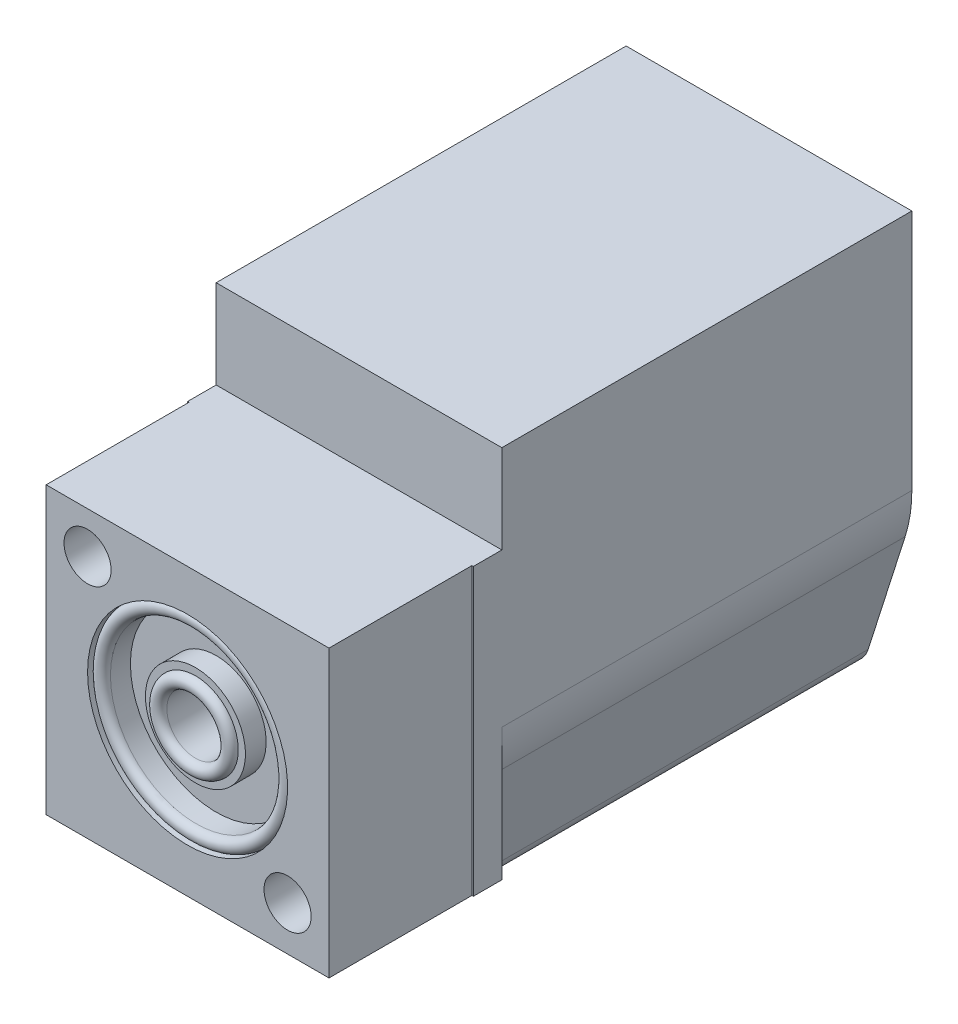
ISO-10303-21;
HEADER;
FILE_DESCRIPTION(('STEP AP214'),'2;1');
FILE_NAME('part.step','',(''),(''),'','','');
FILE_SCHEMA(('AUTOMOTIVE_DESIGN { 1 0 10303 214 1 1 1 1 }'));
ENDSEC;
DATA;
#1=APPLICATION_CONTEXT('core data for automotive mechanical design processes');
#2=APPLICATION_PROTOCOL_DEFINITION('international standard','automotive_design',2000,#1);
#3=PRODUCT_CONTEXT('',#1,'mechanical');
#4=PRODUCT('Part','Part','',(#3));
#5=PRODUCT_RELATED_PRODUCT_CATEGORY('part','',(#4));
#6=PRODUCT_DEFINITION_FORMATION('','',#4);
#7=PRODUCT_DEFINITION_CONTEXT('part definition',#1,'design');
#8=PRODUCT_DEFINITION('design','',#6,#7);
#9=PRODUCT_DEFINITION_SHAPE('','',#8);
#10=(LENGTH_UNIT() NAMED_UNIT(*) SI_UNIT(.MILLI.,.METRE.));
#11=(NAMED_UNIT(*) PLANE_ANGLE_UNIT() SI_UNIT($,.RADIAN.));
#12=(NAMED_UNIT(*) SI_UNIT($,.STERADIAN.) SOLID_ANGLE_UNIT());
#13=UNCERTAINTY_MEASURE_WITH_UNIT(LENGTH_MEASURE(1.E-05),#10,'distance_accuracy_value','');
#14=(GEOMETRIC_REPRESENTATION_CONTEXT(3) GLOBAL_UNCERTAINTY_ASSIGNED_CONTEXT((#13)) GLOBAL_UNIT_ASSIGNED_CONTEXT((#10,
#11,#12)) REPRESENTATION_CONTEXT('',''));
#15=CARTESIAN_POINT('',(0.,0.,0.));
#16=DIRECTION('',(0.,0.,1.));
#17=DIRECTION('',(1.,0.,0.));
#18=AXIS2_PLACEMENT_3D('',#15,#16,#17);
#19=CARTESIAN_POINT('',(2.999642866253,-9.099642866253,28.7));
#20=DIRECTION('',(0.,0.,-1.));
#21=DIRECTION('',(0.,-1.,0.));
#22=AXIS2_PLACEMENT_3D('',#19,#20,#21);
#23=PLANE('',#22);
#24=CARTESIAN_POINT('',(2.999642866253,-9.099642866253,28.7));
#25=DIRECTION('',(0.,0.,-1.));
#26=DIRECTION('',(-1.,0.,0.));
#27=AXIS2_PLACEMENT_3D('',#24,#25,#26);
#28=CIRCLE('',#27,1.65);
#29=CARTESIAN_POINT('',(4.649642866253,-9.099642866253,28.7));
#30=VERTEX_POINT('',#29);
#31=EDGE_CURVE('E11',#30,#30,#28,.T.);
#32=ORIENTED_EDGE('',*,*,#31,.F.);
#33=EDGE_LOOP('',(#32));
#34=FACE_BOUND('',#33,.T.);
#35=ADVANCED_FACE('F17',(#34),#23,.F.);
#36=CARTESIAN_POINT('',(2.999642866253,-9.099642866253,40.7));
#37=DIRECTION('',(0.,0.,-1.));
#38=DIRECTION('',(-1.,0.,0.));
#39=AXIS2_PLACEMENT_3D('',#36,#37,#38);
#40=CYLINDRICAL_SURFACE('',#39,1.65);
#41=CARTESIAN_POINT('',(2.999642866253,-9.099642866253,40.7));
#42=DIRECTION('',(0.,0.,-1.));
#43=DIRECTION('',(-1.,0.,0.));
#44=AXIS2_PLACEMENT_3D('',#41,#42,#43);
#45=CIRCLE('',#44,1.65);
#46=CARTESIAN_POINT('',(4.649642866253,-9.099642866253,40.7));
#47=VERTEX_POINT('',#46);
#48=EDGE_CURVE('E272',#47,#47,#45,.T.);
#49=ORIENTED_EDGE('',*,*,#48,.F.);
#50=DIRECTION('',(0.,0.,-1.));
#51=VECTOR('',#50,1.);
#52=CARTESIAN_POINT('',(4.649642866253,-9.099642866253,40.7));
#53=LINE('',#52,#51);
#54=EDGE_CURVE('E28',#47,#30,#53,.T.);
#55=ORIENTED_EDGE('',*,*,#54,.T.);
#56=ORIENTED_EDGE('',*,*,#31,.T.);
#57=ORIENTED_EDGE('',*,*,#54,.F.);
#58=EDGE_LOOP('',(#49,#55,#56,#57));
#59=FACE_BOUND('',#58,.T.);
#60=ADVANCED_FACE('F676',(#59),#40,.F.);
#61=CARTESIAN_POINT('',(10.,-16.1,35.7));
#62=DIRECTION('',(0.,0.,-1.));
#63=DIRECTION('',(0.,-1.,0.));
#64=AXIS2_PLACEMENT_3D('',#61,#62,#63);
#65=PLANE('',#64);
#66=CARTESIAN_POINT('',(10.,-16.1,35.7));
#67=DIRECTION('',(0.,0.,-1.));
#68=DIRECTION('',(-1.,0.,0.));
#69=AXIS2_PLACEMENT_3D('',#66,#67,#68);
#70=CIRCLE('',#69,1.25);
#71=CARTESIAN_POINT('',(11.25,-16.1,35.7));
#72=VERTEX_POINT('',#71);
#73=EDGE_CURVE('E21',#72,#72,#70,.T.);
#74=ORIENTED_EDGE('',*,*,#73,.F.);
#75=EDGE_LOOP('',(#74));
#76=FACE_BOUND('',#75,.T.);
#77=ADVANCED_FACE('F681',(#76),#65,.F.);
#78=CARTESIAN_POINT('',(10.,-16.1,40.7));
#79=DIRECTION('',(0.,0.,-1.));
#80=DIRECTION('',(-1.,0.,0.));
#81=AXIS2_PLACEMENT_3D('',#78,#79,#80);
#82=CYLINDRICAL_SURFACE('',#81,1.25);
#83=CARTESIAN_POINT('',(10.,-16.1,37.3));
#84=DIRECTION('',(0.,0.,-1.));
#85=DIRECTION('',(-1.,0.,0.));
#86=AXIS2_PLACEMENT_3D('',#83,#84,#85);
#87=CIRCLE('',#86,1.25);
#88=CARTESIAN_POINT('',(11.25,-16.1,37.3));
#89=VERTEX_POINT('',#88);
#90=EDGE_CURVE('E358',#89,#89,#87,.T.);
#91=ORIENTED_EDGE('',*,*,#90,.F.);
#92=DIRECTION('',(0.,0.,-1.));
#93=VECTOR('',#92,1.);
#94=CARTESIAN_POINT('',(11.25,-16.1,40.7));
#95=LINE('',#94,#93);
#96=EDGE_CURVE('E362',#89,#72,#95,.T.);
#97=ORIENTED_EDGE('',*,*,#96,.T.);
#98=ORIENTED_EDGE('',*,*,#73,.T.);
#99=ORIENTED_EDGE('',*,*,#96,.F.);
#100=EDGE_LOOP('',(#91,#97,#98,#99));
#101=FACE_BOUND('',#100,.T.);
#102=ADVANCED_FACE('F795',(#101),#82,.F.);
#103=CARTESIAN_POINT('',(10.,-16.1,37.3));
#104=DIRECTION('',(0.,0.,-1.));
#105=DIRECTION('',(0.,-1.,0.));
#106=AXIS2_PLACEMENT_3D('',#103,#104,#105);
#107=PLANE('',#106);
#108=ORIENTED_EDGE('',*,*,#90,.T.);
#109=EDGE_LOOP('',(#108));
#110=FACE_BOUND('',#109,.T.);
#111=CARTESIAN_POINT('',(10.,-16.1,37.3));
#112=DIRECTION('',(0.,0.,-1.));
#113=DIRECTION('',(1.,0.,0.));
#114=AXIS2_PLACEMENT_3D('',#111,#112,#113);
#115=CIRCLE('',#114,2.);
#116=CARTESIAN_POINT('',(8.,-16.1,37.3));
#117=VERTEX_POINT('',#116);
#118=EDGE_CURVE('E363',#117,#117,#115,.T.);
#119=ORIENTED_EDGE('',*,*,#118,.F.);
#120=EDGE_LOOP('',(#119));
#121=FACE_BOUND('',#120,.T.);
#122=ADVANCED_FACE('F867',(#110,#121),#107,.F.);
#123=CARTESIAN_POINT('',(10.,-16.1,40.87));
#124=DIRECTION('',(0.,0.,-1.));
#125=DIRECTION('',(1.,0.,0.));
#126=AXIS2_PLACEMENT_3D('',#123,#124,#125);
#127=CYLINDRICAL_SURFACE('',#126,2.);
#128=CARTESIAN_POINT('',(10.,-16.1,40.15));
#129=DIRECTION('',(0.,0.,-1.));
#130=DIRECTION('',(1.,0.,0.));
#131=AXIS2_PLACEMENT_3D('',#128,#129,#130);
#132=CIRCLE('',#131,2.);
#133=CARTESIAN_POINT('',(8.,-16.1,40.15));
#134=VERTEX_POINT('',#133);
#135=EDGE_CURVE('E346',#134,#134,#132,.T.);
#136=ORIENTED_EDGE('',*,*,#135,.F.);
#137=DIRECTION('',(0.,0.,-1.));
#138=VECTOR('',#137,1.);
#139=CARTESIAN_POINT('',(8.,-16.1,40.87));
#140=LINE('',#139,#138);
#141=EDGE_CURVE('E350',#134,#117,#140,.T.);
#142=ORIENTED_EDGE('',*,*,#141,.T.);
#143=ORIENTED_EDGE('',*,*,#118,.T.);
#144=ORIENTED_EDGE('',*,*,#141,.F.);
#145=EDGE_LOOP('',(#136,#142,#143,#144));
#146=FACE_BOUND('',#145,.T.);
#147=ADVANCED_FACE('F772',(#146),#127,.F.);
#148=CARTESIAN_POINT('',(10.,-16.1,40.15));
#149=DIRECTION('',(0.,0.,-1.));
#150=DIRECTION('',(1.,0.,0.));
#151=AXIS2_PLACEMENT_3D('',#148,#149,#150);
#152=TOROIDAL_SURFACE('',#151,2.5,0.5);
#153=CARTESIAN_POINT('',(10.,-16.1,40.15));
#154=DIRECTION('',(0.,0.,1.));
#155=DIRECTION('',(1.,0.,0.));
#156=AXIS2_PLACEMENT_3D('',#153,#154,#155);
#157=CIRCLE('',#156,3.);
#158=CARTESIAN_POINT('',(7.,-16.1,40.15));
#159=VERTEX_POINT('',#158);
#160=EDGE_CURVE('E324',#159,#159,#157,.T.);
#161=ORIENTED_EDGE('',*,*,#160,.T.);
#162=CARTESIAN_POINT('',(7.5,-16.1,40.15));
#163=DIRECTION('',(0.,1.,0.));
#164=DIRECTION('',(-1.,0.,0.));
#165=AXIS2_PLACEMENT_3D('',#162,#163,#164);
#166=CIRCLE('',#165,0.5);
#167=EDGE_CURVE('E351',#159,#134,#166,.T.);
#168=ORIENTED_EDGE('',*,*,#167,.T.);
#169=ORIENTED_EDGE('',*,*,#135,.T.);
#170=ORIENTED_EDGE('',*,*,#167,.F.);
#171=EDGE_LOOP('',(#161,#168,#169,#170));
#172=FACE_BOUND('',#171,.T.);
#173=ADVANCED_FACE('F752',(#172),#152,.T.);
#174=CARTESIAN_POINT('',(10.,-16.1,40.15));
#175=DIRECTION('',(0.,0.,-1.));
#176=DIRECTION('',(0.,-1.,0.));
#177=AXIS2_PLACEMENT_3D('',#174,#175,#176);
#178=PLANE('',#177);
#179=ORIENTED_EDGE('',*,*,#160,.F.);
#180=EDGE_LOOP('',(#179));
#181=FACE_BOUND('',#180,.T.);
#182=CARTESIAN_POINT('',(10.,-16.1,40.15));
#183=DIRECTION('',(0.,0.,-1.));
#184=DIRECTION('',(-1.,0.,0.));
#185=AXIS2_PLACEMENT_3D('',#182,#183,#184);
#186=CIRCLE('',#185,3.5);
#187=CARTESIAN_POINT('',(6.5,-16.1,40.15));
#188=VERTEX_POINT('',#187);
#189=EDGE_CURVE('E321',#188,#188,#186,.T.);
#190=ORIENTED_EDGE('',*,*,#189,.F.);
#191=EDGE_LOOP('',(#190));
#192=FACE_BOUND('',#191,.T.);
#193=ADVANCED_FACE('F747',(#181,#192),#178,.F.);
#194=CARTESIAN_POINT('',(10.,-16.1,40.8));
#195=DIRECTION('',(0.,0.,-1.));
#196=DIRECTION('',(1.,0.,0.));
#197=AXIS2_PLACEMENT_3D('',#194,#195,#196);
#198=CYLINDRICAL_SURFACE('',#197,3.5);
#199=CARTESIAN_POINT('',(10.,-16.1,38.7));
#200=DIRECTION('',(0.,0.,1.));
#201=DIRECTION('',(1.,0.,0.));
#202=AXIS2_PLACEMENT_3D('',#199,#200,#201);
#203=CIRCLE('',#202,3.5);
#204=CARTESIAN_POINT('',(6.5,-16.1,38.7));
#205=VERTEX_POINT('',#204);
#206=EDGE_CURVE('E429',#205,#205,#203,.T.);
#207=ORIENTED_EDGE('',*,*,#206,.T.);
#208=DIRECTION('',(0.,0.,1.));
#209=VECTOR('',#208,1.);
#210=CARTESIAN_POINT('',(6.5,-16.1,40.8));
#211=LINE('',#210,#209);
#212=EDGE_CURVE('E325',#205,#188,#211,.T.);
#213=ORIENTED_EDGE('',*,*,#212,.T.);
#214=ORIENTED_EDGE('',*,*,#189,.T.);
#215=ORIENTED_EDGE('',*,*,#212,.F.);
#216=EDGE_LOOP('',(#207,#213,#214,#215));
#217=FACE_BOUND('',#216,.T.);
#218=ADVANCED_FACE('F19',(#217),#198,.T.);
#219=CARTESIAN_POINT('',(10.,-16.1,38.7));
#220=DIRECTION('',(0.,0.,-1.));
#221=DIRECTION('',(0.,-1.,0.));
#222=AXIS2_PLACEMENT_3D('',#219,#220,#221);
#223=PLANE('',#222);
#224=ORIENTED_EDGE('',*,*,#206,.F.);
#225=EDGE_LOOP('',(#224));
#226=FACE_BOUND('',#225,.T.);
#227=CARTESIAN_POINT('',(10.,-16.1,38.7));
#228=DIRECTION('',(0.,0.,1.));
#229=DIRECTION('',(1.,0.,0.));
#230=AXIS2_PLACEMENT_3D('',#227,#228,#229);
#231=CIRCLE('',#230,6.);
#232=CARTESIAN_POINT('',(4.,-16.1,38.7));
#233=VERTEX_POINT('',#232);
#234=EDGE_CURVE('E522',#233,#233,#231,.T.);
#235=ORIENTED_EDGE('',*,*,#234,.T.);
#236=EDGE_LOOP('',(#235));
#237=FACE_BOUND('',#236,.T.);
#238=ADVANCED_FACE('F847',(#226,#237),#223,.F.);
#239=CARTESIAN_POINT('',(10.,-16.1,40.8));
#240=DIRECTION('',(0.,0.,-1.));
#241=DIRECTION('',(1.,0.,0.));
#242=AXIS2_PLACEMENT_3D('',#239,#240,#241);
#243=CYLINDRICAL_SURFACE('',#242,6.);
#244=CARTESIAN_POINT('',(10.,-16.1,40.1));
#245=DIRECTION('',(0.,0.,-1.));
#246=DIRECTION('',(-1.,0.,0.));
#247=AXIS2_PLACEMENT_3D('',#244,#245,#246);
#248=CIRCLE('',#247,6.);
#249=CARTESIAN_POINT('',(4.,-16.1,40.1));
#250=VERTEX_POINT('',#249);
#251=EDGE_CURVE('E416',#250,#250,#248,.T.);
#252=ORIENTED_EDGE('',*,*,#251,.F.);
#253=DIRECTION('',(0.,0.,-1.));
#254=VECTOR('',#253,1.);
#255=CARTESIAN_POINT('',(4.,-16.1,40.8));
#256=LINE('',#255,#254);
#257=EDGE_CURVE('E512',#250,#233,#256,.T.);
#258=ORIENTED_EDGE('',*,*,#257,.T.);
#259=ORIENTED_EDGE('',*,*,#234,.F.);
#260=ORIENTED_EDGE('',*,*,#257,.F.);
#261=EDGE_LOOP('',(#252,#258,#259,#260));
#262=FACE_BOUND('',#261,.T.);
#263=ADVANCED_FACE('F841',(#262),#243,.F.);
#264=CARTESIAN_POINT('',(10.,-16.1,40.1));
#265=DIRECTION('',(0.,0.,-1.));
#266=DIRECTION('',(1.,0.,0.));
#267=AXIS2_PLACEMENT_3D('',#264,#265,#266);
#268=TOROIDAL_SURFACE('',#267,6.5,0.5);
#269=CARTESIAN_POINT('',(10.,-16.1,40.1));
#270=DIRECTION('',(0.,0.,-1.));
#271=DIRECTION('',(1.,0.,0.));
#272=AXIS2_PLACEMENT_3D('',#269,#270,#271);
#273=CIRCLE('',#272,7.);
#274=CARTESIAN_POINT('',(3.,-16.1,40.1));
#275=VERTEX_POINT('',#274);
#276=EDGE_CURVE('E382',#275,#275,#273,.T.);
#277=ORIENTED_EDGE('',*,*,#276,.F.);
#278=CARTESIAN_POINT('',(3.5,-16.1,40.1));
#279=DIRECTION('',(0.,1.,0.));
#280=DIRECTION('',(-1.,0.,0.));
#281=AXIS2_PLACEMENT_3D('',#278,#279,#280);
#282=CIRCLE('',#281,0.5);
#283=EDGE_CURVE('E386',#275,#250,#282,.T.);
#284=ORIENTED_EDGE('',*,*,#283,.T.);
#285=ORIENTED_EDGE('',*,*,#251,.T.);
#286=ORIENTED_EDGE('',*,*,#283,.F.);
#287=EDGE_LOOP('',(#277,#284,#285,#286));
#288=FACE_BOUND('',#287,.T.);
#289=ADVANCED_FACE('F715',(#288),#268,.T.);
#290=CARTESIAN_POINT('',(10.,-16.1,40.73));
#291=DIRECTION('',(0.,0.,-1.));
#292=DIRECTION('',(1.,0.,0.));
#293=AXIS2_PLACEMENT_3D('',#290,#291,#292);
#294=CYLINDRICAL_SURFACE('',#293,7.);
#295=CARTESIAN_POINT('',(10.,-16.1,40.7));
#296=DIRECTION('',(0.,0.,-1.));
#297=DIRECTION('',(1.,0.,0.));
#298=AXIS2_PLACEMENT_3D('',#295,#296,#297);
#299=CIRCLE('',#298,7.);
#300=CARTESIAN_POINT('',(3.,-16.1,40.7));
#301=VERTEX_POINT('',#300);
#302=EDGE_CURVE('E279',#301,#301,#299,.T.);
#303=ORIENTED_EDGE('',*,*,#302,.F.);
#304=DIRECTION('',(0.,0.,-1.));
#305=VECTOR('',#304,1.);
#306=CARTESIAN_POINT('',(3.,-16.1,40.73));
#307=LINE('',#306,#305);
#308=EDGE_CURVE('E387',#301,#275,#307,.T.);
#309=ORIENTED_EDGE('',*,*,#308,.T.);
#310=ORIENTED_EDGE('',*,*,#276,.T.);
#311=ORIENTED_EDGE('',*,*,#308,.F.);
#312=EDGE_LOOP('',(#303,#309,#310,#311));
#313=FACE_BOUND('',#312,.T.);
#314=ADVANCED_FACE('F709',(#313),#294,.F.);
#315=CARTESIAN_POINT('',(19.9,-26.2,30.7));
#316=DIRECTION('',(1.,0.,0.));
#317=DIRECTION('',(0.,1.,0.));
#318=AXIS2_PLACEMENT_3D('',#315,#316,#317);
#319=PLANE('',#318);
#320=DIRECTION('',(0.,1.,0.));
#321=VECTOR('',#320,1.);
#322=CARTESIAN_POINT('',(19.9,-26.2,30.7));
#323=LINE('',#322,#321);
#324=CARTESIAN_POINT('',(19.9,-26.2,30.7));
#325=VERTEX_POINT('',#324);
#326=CARTESIAN_POINT('',(19.9,-6.2,30.7));
#327=VERTEX_POINT('',#326);
#328=EDGE_CURVE('E453',#325,#327,#323,.T.);
#329=ORIENTED_EDGE('',*,*,#328,.T.);
#330=DIRECTION('',(0.,0.,1.));
#331=VECTOR('',#330,1.);
#332=CARTESIAN_POINT('',(19.9,-6.2,30.7));
#333=LINE('',#332,#331);
#334=CARTESIAN_POINT('',(19.9,-6.2,40.7));
#335=VERTEX_POINT('',#334);
#336=EDGE_CURVE('E409',#327,#335,#333,.T.);
#337=ORIENTED_EDGE('',*,*,#336,.T.);
#338=DIRECTION('',(0.,1.,0.));
#339=VECTOR('',#338,1.);
#340=CARTESIAN_POINT('',(19.9,-26.2,40.7));
#341=LINE('',#340,#339);
#342=CARTESIAN_POINT('',(19.9,-26.2,40.7));
#343=VERTEX_POINT('',#342);
#344=EDGE_CURVE('E393',#343,#335,#341,.T.);
#345=ORIENTED_EDGE('',*,*,#344,.F.);
#346=DIRECTION('',(0.,0.,1.));
#347=VECTOR('',#346,1.);
#348=CARTESIAN_POINT('',(19.9,-26.2,30.7));
#349=LINE('',#348,#347);
#350=EDGE_CURVE('E333',#325,#343,#349,.T.);
#351=ORIENTED_EDGE('',*,*,#350,.F.);
#352=EDGE_LOOP('',(#329,#337,#345,#351));
#353=FACE_BOUND('',#352,.T.);
#354=ADVANCED_FACE('F714',(#353),#319,.T.);
#355=CARTESIAN_POINT('',(20.,0.,0.));
#356=DIRECTION('',(0.,1.,0.));
#357=DIRECTION('',(1.,0.,0.));
#358=AXIS2_PLACEMENT_3D('',#355,#356,#357);
#359=PLANE('',#358);
#360=DIRECTION('',(-1.,0.,0.));
#361=VECTOR('',#360,1.);
#362=CARTESIAN_POINT('',(20.,0.,0.));
#363=LINE('',#362,#361);
#364=CARTESIAN_POINT('',(20.,0.,0.));
#365=VERTEX_POINT('',#364);
#366=CARTESIAN_POINT('',(0.,0.,0.));
#367=VERTEX_POINT('',#366);
#368=EDGE_CURVE('E379',#365,#367,#363,.T.);
#369=ORIENTED_EDGE('',*,*,#368,.T.);
#370=DIRECTION('',(0.,0.,1.));
#371=VECTOR('',#370,1.);
#372=CARTESIAN_POINT('',(0.,0.,0.));
#373=LINE('',#372,#371);
#374=CARTESIAN_POINT('',(0.,0.,28.7));
#375=VERTEX_POINT('',#374);
#376=EDGE_CURVE('E316',#367,#375,#373,.T.);
#377=ORIENTED_EDGE('',*,*,#376,.T.);
#378=DIRECTION('',(-1.,0.,0.));
#379=VECTOR('',#378,1.);
#380=CARTESIAN_POINT('',(20.,0.,28.7));
#381=LINE('',#380,#379);
#382=CARTESIAN_POINT('',(20.,0.,28.7));
#383=VERTEX_POINT('',#382);
#384=EDGE_CURVE('E344',#383,#375,#381,.T.);
#385=ORIENTED_EDGE('',*,*,#384,.F.);
#386=DIRECTION('',(0.,0.,1.));
#387=VECTOR('',#386,1.);
#388=CARTESIAN_POINT('',(20.,0.,0.));
#389=LINE('',#388,#387);
#390=EDGE_CURVE('E506',#365,#383,#389,.T.);
#391=ORIENTED_EDGE('',*,*,#390,.F.);
#392=EDGE_LOOP('',(#369,#377,#385,#391));
#393=FACE_BOUND('',#392,.T.);
#394=ADVANCED_FACE('F804',(#393),#359,.T.);
#395=CARTESIAN_POINT('',(0.,-29.5,0.));
#396=DIRECTION('',(0.,-1.,0.));
#397=DIRECTION('',(0.,0.,-1.));
#398=AXIS2_PLACEMENT_3D('',#395,#396,#397);
#399=PLANE('',#398);
#400=DIRECTION('',(0.,0.,1.));
#401=VECTOR('',#400,1.);
#402=CARTESIAN_POINT('',(15.03756429443,-29.5,0.));
#403=LINE('',#402,#401);
#404=CARTESIAN_POINT('',(15.03756429443,-29.5,0.));
#405=VERTEX_POINT('',#404);
#406=CARTESIAN_POINT('',(15.03756429443,-29.5,28.7));
#407=VERTEX_POINT('',#406);
#408=EDGE_CURVE('E458',#405,#407,#403,.T.);
#409=ORIENTED_EDGE('',*,*,#408,.T.);
#410=DIRECTION('',(1.,0.,0.));
#411=VECTOR('',#410,1.);
#412=CARTESIAN_POINT('',(4.962435705566,-29.5,28.7));
#413=LINE('',#412,#411);
#414=CARTESIAN_POINT('',(4.962435705566,-29.5,28.7));
#415=VERTEX_POINT('',#414);
#416=EDGE_CURVE('E372',#415,#407,#413,.T.);
#417=ORIENTED_EDGE('',*,*,#416,.F.);
#418=DIRECTION('',(0.,0.,-1.));
#419=VECTOR('',#418,1.);
#420=CARTESIAN_POINT('',(4.962435705566,-29.5,28.7));
#421=LINE('',#420,#419);
#422=CARTESIAN_POINT('',(4.962435705566,-29.5,0.));
#423=VERTEX_POINT('',#422);
#424=EDGE_CURVE('E402',#415,#423,#421,.T.);
#425=ORIENTED_EDGE('',*,*,#424,.T.);
#426=DIRECTION('',(1.,0.,0.));
#427=VECTOR('',#426,1.);
#428=CARTESIAN_POINT('',(4.962435705566,-29.5,0.));
#429=LINE('',#428,#427);
#430=EDGE_CURVE('E408',#423,#405,#429,.T.);
#431=ORIENTED_EDGE('',*,*,#430,.T.);
#432=EDGE_LOOP('',(#409,#417,#425,#431));
#433=FACE_BOUND('',#432,.T.);
#434=ADVANCED_FACE('F898',(#433),#399,.T.);
#435=CARTESIAN_POINT('',(4.962435705566,-27.5,93.75652));
#436=DIRECTION('',(0.,0.,-1.));
#437=DIRECTION('',(0.,-1.,0.));
#438=AXIS2_PLACEMENT_3D('',#435,#436,#437);
#439=CYLINDRICAL_SURFACE('',#438,2.);
#440=CARTESIAN_POINT('',(4.962435705566,-27.5,0.));
#441=DIRECTION('',(0.,0.,-1.));
#442=DIRECTION('',(0.,-1.,0.));
#443=AXIS2_PLACEMENT_3D('',#440,#441,#442);
#444=CIRCLE('',#443,2.);
#445=CARTESIAN_POINT('',(3.05658414554,-28.10640731455,0.));
#446=VERTEX_POINT('',#445);
#447=EDGE_CURVE('E403',#423,#446,#444,.T.);
#448=ORIENTED_EDGE('',*,*,#447,.F.);
#449=ORIENTED_EDGE('',*,*,#424,.F.);
#450=CARTESIAN_POINT('',(4.962435705566,-27.5,28.7));
#451=DIRECTION('',(0.,0.,1.));
#452=DIRECTION('',(-0.952925780013279,-0.303203657276893,0.));
#453=AXIS2_PLACEMENT_3D('',#450,#451,#452);
#454=CIRCLE('',#453,2.);
#455=CARTESIAN_POINT('',(3.05658414554,-28.10640731455,28.7));
#456=VERTEX_POINT('',#455);
#457=EDGE_CURVE('E421',#456,#415,#454,.T.);
#458=ORIENTED_EDGE('',*,*,#457,.F.);
#459=DIRECTION('',(0.,0.,-1.));
#460=VECTOR('',#459,1.);
#461=CARTESIAN_POINT('',(3.05658414554,-28.10640731455,28.7));
#462=LINE('',#461,#460);
#463=EDGE_CURVE('E461',#456,#446,#462,.T.);
#464=ORIENTED_EDGE('',*,*,#463,.T.);
#465=EDGE_LOOP('',(#448,#449,#458,#464));
#466=FACE_BOUND('',#465,.T.);
#467=ADVANCED_FACE('F831',(#466),#439,.T.);
#468=CARTESIAN_POINT('',(0.,-18.5,0.));
#469=DIRECTION('',(0.952925780013279,0.303203657276893,0.));
#470=DIRECTION('',(0.,0.,-1.));
#471=AXIS2_PLACEMENT_3D('',#468,#469,#470);
#472=PLANE('',#471);
#473=ORIENTED_EDGE('',*,*,#463,.F.);
#474=DIRECTION('',(0.303203657276893,-0.952925780013279,0.));
#475=VECTOR('',#474,1.);
#476=CARTESIAN_POINT('',(2.45,-26.2,28.7));
#477=LINE('',#476,#475);
#478=CARTESIAN_POINT('',(2.45,-26.2,28.7));
#479=VERTEX_POINT('',#478);
#480=EDGE_CURVE('E417',#479,#456,#477,.T.);
#481=ORIENTED_EDGE('',*,*,#480,.F.);
#482=DIRECTION('',(0.303203657276893,-0.952925780013279,0.));
#483=VECTOR('',#482,1.);
#484=CARTESIAN_POINT('',(0.4707421998674,-19.9794754853,28.7));
#485=LINE('',#484,#483);
#486=CARTESIAN_POINT('',(0.4707421998674,-19.9794754853,28.7));
#487=VERTEX_POINT('',#486);
#488=EDGE_CURVE('E338',#487,#479,#485,.T.);
#489=ORIENTED_EDGE('',*,*,#488,.F.);
#490=DIRECTION('',(0.,0.,1.));
#491=VECTOR('',#490,1.);
#492=CARTESIAN_POINT('',(0.4707421998674,-19.9794754853,0.));
#493=LINE('',#492,#491);
#494=CARTESIAN_POINT('',(0.4707421998674,-19.9794754853,0.));
#495=VERTEX_POINT('',#494);
#496=EDGE_CURVE('E319',#495,#487,#493,.T.);
#497=ORIENTED_EDGE('',*,*,#496,.F.);
#498=DIRECTION('',(0.303203657276893,-0.952925780013279,0.));
#499=VECTOR('',#498,1.);
#500=CARTESIAN_POINT('',(0.4707421998674,-19.9794754853,0.));
#501=LINE('',#500,#499);
#502=EDGE_CURVE('E407',#495,#446,#501,.T.);
#503=ORIENTED_EDGE('',*,*,#502,.T.);
#504=EDGE_LOOP('',(#473,#481,#489,#497,#503));
#505=FACE_BOUND('',#504,.T.);
#506=ADVANCED_FACE('F826',(#505),#472,.F.);
#507=CARTESIAN_POINT('',(10.,-16.94743891253,-53.05652));
#508=DIRECTION('',(0.,0.,1.));
#509=DIRECTION('',(-1.,0.,0.));
#510=AXIS2_PLACEMENT_3D('',#507,#508,#509);
#511=CYLINDRICAL_SURFACE('',#510,10.);
#512=ORIENTED_EDGE('',*,*,#496,.T.);
#513=CARTESIAN_POINT('',(10.,-16.94743891253,28.7));
#514=DIRECTION('',(0.,0.,1.));
#515=DIRECTION('',(-1.,0.,0.));
#516=AXIS2_PLACEMENT_3D('',#513,#514,#515);
#517=CIRCLE('',#516,10.);
#518=CARTESIAN_POINT('',(0.,-16.94743891253,28.7));
#519=VERTEX_POINT('',#518);
#520=EDGE_CURVE('E435',#519,#487,#517,.T.);
#521=ORIENTED_EDGE('',*,*,#520,.F.);
#522=DIRECTION('',(0.,0.,1.));
#523=VECTOR('',#522,1.);
#524=CARTESIAN_POINT('',(0.,-16.94743891253,0.));
#525=LINE('',#524,#523);
#526=CARTESIAN_POINT('',(0.,-16.94743891253,0.));
#527=VERTEX_POINT('',#526);
#528=EDGE_CURVE('E320',#527,#519,#525,.T.);
#529=ORIENTED_EDGE('',*,*,#528,.F.);
#530=CARTESIAN_POINT('',(10.,-16.94743891253,0.));
#531=DIRECTION('',(0.,0.,-1.));
#532=DIRECTION('',(-0.952925780013279,-0.303203657276893,0.));
#533=AXIS2_PLACEMENT_3D('',#530,#531,#532);
#534=CIRCLE('',#533,10.);
#535=EDGE_CURVE('E441',#495,#527,#534,.T.);
#536=ORIENTED_EDGE('',*,*,#535,.F.);
#537=EDGE_LOOP('',(#512,#521,#529,#536));
#538=FACE_BOUND('',#537,.T.);
#539=ADVANCED_FACE('F489',(#538),#511,.T.);
#540=CARTESIAN_POINT('',(0.,0.,0.));
#541=DIRECTION('',(-1.,0.,0.));
#542=DIRECTION('',(0.,0.,1.));
#543=AXIS2_PLACEMENT_3D('',#540,#541,#542);
#544=PLANE('',#543);
#545=ORIENTED_EDGE('',*,*,#528,.T.);
#546=DIRECTION('',(0.,-1.,0.));
#547=VECTOR('',#546,1.);
#548=CARTESIAN_POINT('',(0.,-16.94743891253,28.7));
#549=LINE('',#548,#547);
#550=CARTESIAN_POINT('',(0.,-26.2,28.7));
#551=VERTEX_POINT('',#550);
#552=EDGE_CURVE('E440',#519,#551,#549,.T.);
#553=ORIENTED_EDGE('',*,*,#552,.T.);
#554=DIRECTION('',(0.,0.,1.));
#555=VECTOR('',#554,1.);
#556=CARTESIAN_POINT('',(0.,-26.2,28.7));
#557=LINE('',#556,#555);
#558=CARTESIAN_POINT('',(0.,-26.2,30.7));
#559=VERTEX_POINT('',#558);
#560=EDGE_CURVE('E330',#551,#559,#557,.T.);
#561=ORIENTED_EDGE('',*,*,#560,.T.);
#562=DIRECTION('',(0.,-1.,0.));
#563=VECTOR('',#562,1.);
#564=CARTESIAN_POINT('',(0.,-6.2,30.7));
#565=LINE('',#564,#563);
#566=CARTESIAN_POINT('',(0.,-6.2,30.7));
#567=VERTEX_POINT('',#566);
#568=EDGE_CURVE('E394',#567,#559,#565,.T.);
#569=ORIENTED_EDGE('',*,*,#568,.F.);
#570=DIRECTION('',(0.,0.,1.));
#571=VECTOR('',#570,1.);
#572=CARTESIAN_POINT('',(0.,-6.2,28.7));
#573=LINE('',#572,#571);
#574=CARTESIAN_POINT('',(0.,-6.2,28.7));
#575=VERTEX_POINT('',#574);
#576=EDGE_CURVE('E293',#575,#567,#573,.T.);
#577=ORIENTED_EDGE('',*,*,#576,.F.);
#578=DIRECTION('',(0.,-1.,0.));
#579=VECTOR('',#578,1.);
#580=CARTESIAN_POINT('',(0.,0.,28.7));
#581=LINE('',#580,#579);
#582=EDGE_CURVE('E434',#375,#575,#581,.T.);
#583=ORIENTED_EDGE('',*,*,#582,.F.);
#584=ORIENTED_EDGE('',*,*,#376,.F.);
#585=DIRECTION('',(0.,-1.,0.));
#586=VECTOR('',#585,1.);
#587=CARTESIAN_POINT('',(0.,0.,0.));
#588=LINE('',#587,#586);
#589=EDGE_CURVE('E444',#367,#527,#588,.T.);
#590=ORIENTED_EDGE('',*,*,#589,.T.);
#591=EDGE_LOOP('',(#545,#553,#561,#569,#577,#583,#584,#590));
#592=FACE_BOUND('',#591,.T.);
#593=ADVANCED_FACE('F483',(#592),#544,.T.);
#594=CARTESIAN_POINT('',(0.,-26.2,28.7));
#595=DIRECTION('',(0.,-1.,0.));
#596=DIRECTION('',(0.,0.,-1.));
#597=AXIS2_PLACEMENT_3D('',#594,#595,#596);
#598=PLANE('',#597);
#599=DIRECTION('',(1.,0.,0.));
#600=VECTOR('',#599,1.);
#601=CARTESIAN_POINT('',(0.,-26.2,28.7));
#602=LINE('',#601,#600);
#603=EDGE_CURVE('E449',#551,#479,#602,.T.);
#604=ORIENTED_EDGE('',*,*,#603,.T.);
#605=DIRECTION('',(1.,0.,0.));
#606=VECTOR('',#605,1.);
#607=CARTESIAN_POINT('',(2.45,-26.2,28.7));
#608=LINE('',#607,#606);
#609=CARTESIAN_POINT('',(17.55,-26.2,28.7));
#610=VERTEX_POINT('',#609);
#611=EDGE_CURVE('E422',#479,#610,#608,.T.);
#612=ORIENTED_EDGE('',*,*,#611,.T.);
#613=DIRECTION('',(1.,0.,0.));
#614=VECTOR('',#613,1.);
#615=CARTESIAN_POINT('',(17.55,-26.2,28.7));
#616=LINE('',#615,#614);
#617=CARTESIAN_POINT('',(20.,-26.2,28.7));
#618=VERTEX_POINT('',#617);
#619=EDGE_CURVE('E339',#610,#618,#616,.T.);
#620=ORIENTED_EDGE('',*,*,#619,.T.);
#621=DIRECTION('',(0.,0.,1.));
#622=VECTOR('',#621,1.);
#623=CARTESIAN_POINT('',(20.,-26.2,28.7));
#624=LINE('',#623,#622);
#625=CARTESIAN_POINT('',(20.,-26.2,30.7));
#626=VERTEX_POINT('',#625);
#627=EDGE_CURVE('E507',#618,#626,#624,.T.);
#628=ORIENTED_EDGE('',*,*,#627,.T.);
#629=DIRECTION('',(1.,0.,0.));
#630=VECTOR('',#629,1.);
#631=CARTESIAN_POINT('',(19.9,-26.2,30.7));
#632=LINE('',#631,#630);
#633=EDGE_CURVE('E355',#325,#626,#632,.T.);
#634=ORIENTED_EDGE('',*,*,#633,.F.);
#635=ORIENTED_EDGE('',*,*,#350,.T.);
#636=DIRECTION('',(1.,0.,0.));
#637=VECTOR('',#636,1.);
#638=CARTESIAN_POINT('',(0.1,-26.2,40.7));
#639=LINE('',#638,#637);
#640=CARTESIAN_POINT('',(0.1,-26.2,40.7));
#641=VERTEX_POINT('',#640);
#642=EDGE_CURVE('E304',#641,#343,#639,.T.);
#643=ORIENTED_EDGE('',*,*,#642,.F.);
#644=DIRECTION('',(0.,0.,1.));
#645=VECTOR('',#644,1.);
#646=CARTESIAN_POINT('',(0.1,-26.2,30.7));
#647=LINE('',#646,#645);
#648=CARTESIAN_POINT('',(0.1,-26.2,30.7));
#649=VERTEX_POINT('',#648);
#650=EDGE_CURVE('E305',#649,#641,#647,.T.);
#651=ORIENTED_EDGE('',*,*,#650,.F.);
#652=DIRECTION('',(1.,0.,0.));
#653=VECTOR('',#652,1.);
#654=CARTESIAN_POINT('',(0.,-26.2,30.7));
#655=LINE('',#654,#653);
#656=EDGE_CURVE('E398',#559,#649,#655,.T.);
#657=ORIENTED_EDGE('',*,*,#656,.F.);
#658=ORIENTED_EDGE('',*,*,#560,.F.);
#659=EDGE_LOOP('',(#604,#612,#620,#628,#634,#635,#643,#651,#657,#658));
#660=FACE_BOUND('',#659,.T.);
#661=ADVANCED_FACE('F759',(#660),#598,.T.);
#662=CARTESIAN_POINT('',(10.,-16.94743891253,93.75652));
#663=DIRECTION('',(0.,0.,-1.));
#664=DIRECTION('',(1.,0.,0.));
#665=AXIS2_PLACEMENT_3D('',#662,#663,#664);
#666=CYLINDRICAL_SURFACE('',#665,10.);
#667=CARTESIAN_POINT('',(10.,-16.94743891253,0.));
#668=DIRECTION('',(0.,0.,-1.));
#669=DIRECTION('',(1.,0.,0.));
#670=AXIS2_PLACEMENT_3D('',#667,#668,#669);
#671=CIRCLE('',#670,10.);
#672=CARTESIAN_POINT('',(20.,-16.94743891253,0.));
#673=VERTEX_POINT('',#672);
#674=CARTESIAN_POINT('',(19.52925780013,-19.9794754853,0.));
#675=VERTEX_POINT('',#674);
#676=EDGE_CURVE('E310',#673,#675,#671,.T.);
#677=ORIENTED_EDGE('',*,*,#676,.F.);
#678=DIRECTION('',(0.,0.,-1.));
#679=VECTOR('',#678,1.);
#680=CARTESIAN_POINT('',(20.,-16.94743891253,28.7));
#681=LINE('',#680,#679);
#682=CARTESIAN_POINT('',(20.,-16.94743891253,28.7));
#683=VERTEX_POINT('',#682);
#684=EDGE_CURVE('E439',#683,#673,#681,.T.);
#685=ORIENTED_EDGE('',*,*,#684,.F.);
#686=CARTESIAN_POINT('',(10.,-16.94743891253,28.7));
#687=DIRECTION('',(0.,0.,1.));
#688=DIRECTION('',(0.952925780013279,-0.303203657276893,0.));
#689=AXIS2_PLACEMENT_3D('',#686,#687,#688);
#690=CIRCLE('',#689,10.);
#691=CARTESIAN_POINT('',(19.52925780013,-19.9794754853,28.7));
#692=VERTEX_POINT('',#691);
#693=EDGE_CURVE('E334',#692,#683,#690,.T.);
#694=ORIENTED_EDGE('',*,*,#693,.F.);
#695=DIRECTION('',(0.,0.,-1.));
#696=VECTOR('',#695,1.);
#697=CARTESIAN_POINT('',(19.52925780013,-19.9794754853,28.7));
#698=LINE('',#697,#696);
#699=EDGE_CURVE('E288',#692,#675,#698,.T.);
#700=ORIENTED_EDGE('',*,*,#699,.T.);
#701=EDGE_LOOP('',(#677,#685,#694,#700));
#702=FACE_BOUND('',#701,.T.);
#703=ADVANCED_FACE('F740',(#702),#666,.T.);
#704=CARTESIAN_POINT('',(20.,-29.5,0.));
#705=DIRECTION('',(1.,0.,0.));
#706=DIRECTION('',(0.,1.,0.));
#707=AXIS2_PLACEMENT_3D('',#704,#705,#706);
#708=PLANE('',#707);
#709=ORIENTED_EDGE('',*,*,#684,.T.);
#710=DIRECTION('',(0.,1.,0.));
#711=VECTOR('',#710,1.);
#712=CARTESIAN_POINT('',(20.,-16.94743891253,0.));
#713=LINE('',#712,#711);
#714=EDGE_CURVE('E315',#673,#365,#713,.T.);
#715=ORIENTED_EDGE('',*,*,#714,.T.);
#716=ORIENTED_EDGE('',*,*,#390,.T.);
#717=DIRECTION('',(0.,1.,0.));
#718=VECTOR('',#717,1.);
#719=CARTESIAN_POINT('',(20.,-6.2,28.7));
#720=LINE('',#719,#718);
#721=CARTESIAN_POINT('',(20.,-6.2,28.7));
#722=VERTEX_POINT('',#721);
#723=EDGE_CURVE('E340',#722,#383,#720,.T.);
#724=ORIENTED_EDGE('',*,*,#723,.F.);
#725=DIRECTION('',(0.,0.,1.));
#726=VECTOR('',#725,1.);
#727=CARTESIAN_POINT('',(20.,-6.2,28.7));
#728=LINE('',#727,#726);
#729=CARTESIAN_POINT('',(20.,-6.2,30.7));
#730=VERTEX_POINT('',#729);
#731=EDGE_CURVE('E289',#722,#730,#728,.T.);
#732=ORIENTED_EDGE('',*,*,#731,.T.);
#733=DIRECTION('',(0.,1.,0.));
#734=VECTOR('',#733,1.);
#735=CARTESIAN_POINT('',(20.,-26.2,30.7));
#736=LINE('',#735,#734);
#737=EDGE_CURVE('E352',#626,#730,#736,.T.);
#738=ORIENTED_EDGE('',*,*,#737,.F.);
#739=ORIENTED_EDGE('',*,*,#627,.F.);
#740=DIRECTION('',(0.,1.,0.));
#741=VECTOR('',#740,1.);
#742=CARTESIAN_POINT('',(20.,-26.2,28.7));
#743=LINE('',#742,#741);
#744=EDGE_CURVE('E308',#618,#683,#743,.T.);
#745=ORIENTED_EDGE('',*,*,#744,.T.);
#746=EDGE_LOOP('',(#709,#715,#716,#724,#732,#738,#739,#745));
#747=FACE_BOUND('',#746,.T.);
#748=ADVANCED_FACE('F735',(#747),#708,.T.);
#749=CARTESIAN_POINT('',(0.,0.,28.7));
#750=DIRECTION('',(0.,0.,1.));
#751=DIRECTION('',(1.,0.,0.));
#752=AXIS2_PLACEMENT_3D('',#749,#750,#751);
#753=PLANE('',#752);
#754=ORIENTED_EDGE('',*,*,#488,.T.);
#755=ORIENTED_EDGE('',*,*,#603,.F.);
#756=ORIENTED_EDGE('',*,*,#552,.F.);
#757=ORIENTED_EDGE('',*,*,#520,.T.);
#758=EDGE_LOOP('',(#754,#755,#756,#757));
#759=FACE_BOUND('',#758,.T.);
#760=ADVANCED_FACE('F492',(#759),#753,.F.);
#761=CARTESIAN_POINT('',(0.,0.,28.7));
#762=DIRECTION('',(0.,0.,1.));
#763=DIRECTION('',(1.,0.,0.));
#764=AXIS2_PLACEMENT_3D('',#761,#762,#763);
#765=PLANE('',#764);
#766=ORIENTED_EDGE('',*,*,#744,.F.);
#767=ORIENTED_EDGE('',*,*,#619,.F.);
#768=DIRECTION('',(0.303203657276893,0.952925780013279,0.));
#769=VECTOR('',#768,1.);
#770=CARTESIAN_POINT('',(17.55,-26.2,28.7));
#771=LINE('',#770,#769);
#772=CARTESIAN_POINT('',(18.16405921394,-24.27009961334,28.7));
#773=VERTEX_POINT('',#772);
#774=EDGE_CURVE('E266',#610,#773,#771,.T.);
#775=ORIENTED_EDGE('',*,*,#774,.T.);
#776=CARTESIAN_POINT('',(17.00035713375,-23.10035713375,28.7));
#777=DIRECTION('',(0.,0.,-1.));
#778=DIRECTION('',(1.,0.,0.));
#779=AXIS2_PLACEMENT_3D('',#776,#777,#778);
#780=CIRCLE('',#779,1.65);
#781=CARTESIAN_POINT('',(18.65035713375,-23.10035713375,28.7));
#782=VERTEX_POINT('',#781);
#783=EDGE_CURVE('E262',#782,#773,#780,.T.);
#784=ORIENTED_EDGE('',*,*,#783,.F.);
#785=CARTESIAN_POINT('',(17.00035713375,-23.10035713375,28.7));
#786=DIRECTION('',(0.,0.,-1.));
#787=DIRECTION('',(1.,0.,0.));
#788=AXIS2_PLACEMENT_3D('',#785,#786,#787);
#789=CIRCLE('',#788,1.65);
#790=CARTESIAN_POINT('',(18.62604397914,-22.81814749412,28.7));
#791=VERTEX_POINT('',#790);
#792=EDGE_CURVE('E247',#791,#782,#789,.T.);
#793=ORIENTED_EDGE('',*,*,#792,.F.);
#794=DIRECTION('',(0.303203657276893,0.952925780013279,0.));
#795=VECTOR('',#794,1.);
#796=CARTESIAN_POINT('',(18.62604397914,-22.81814749412,28.7));
#797=LINE('',#796,#795);
#798=EDGE_CURVE('E309',#791,#692,#797,.T.);
#799=ORIENTED_EDGE('',*,*,#798,.T.);
#800=ORIENTED_EDGE('',*,*,#693,.T.);
#801=EDGE_LOOP('',(#766,#767,#775,#784,#793,#799,#800));
#802=FACE_BOUND('',#801,.T.);
#803=ADVANCED_FACE('F264',(#802),#765,.F.);
#804=CARTESIAN_POINT('',(16.5,-29.5,0.));
#805=DIRECTION('',(-0.952925780013279,0.303203657276893,0.));
#806=DIRECTION('',(0.,0.,1.));
#807=AXIS2_PLACEMENT_3D('',#804,#805,#806);
#808=PLANE('',#807);
#809=DIRECTION('',(0.,0.,1.));
#810=VECTOR('',#809,1.);
#811=CARTESIAN_POINT('',(16.94341585446,-28.10640731455,0.));
#812=LINE('',#811,#810);
#813=CARTESIAN_POINT('',(16.94341585446,-28.10640731455,0.));
#814=VERTEX_POINT('',#813);
#815=CARTESIAN_POINT('',(16.94341585446,-28.10640731455,28.7));
#816=VERTEX_POINT('',#815);
#817=EDGE_CURVE('E454',#814,#816,#812,.T.);
#818=ORIENTED_EDGE('',*,*,#817,.F.);
#819=DIRECTION('',(0.303203657276893,0.952925780013279,0.));
#820=VECTOR('',#819,1.);
#821=CARTESIAN_POINT('',(16.94341585446,-28.10640731455,0.));
#822=LINE('',#821,#820);
#823=EDGE_CURVE('E314',#814,#675,#822,.T.);
#824=ORIENTED_EDGE('',*,*,#823,.T.);
#825=ORIENTED_EDGE('',*,*,#699,.F.);
#826=ORIENTED_EDGE('',*,*,#798,.F.);
#827=DIRECTION('',(0.303203657276893,0.952925780013279,0.));
#828=VECTOR('',#827,1.);
#829=CARTESIAN_POINT('',(18.16405921394,-24.27009961334,28.7));
#830=LINE('',#829,#828);
#831=EDGE_CURVE('E260',#773,#791,#830,.T.);
#832=ORIENTED_EDGE('',*,*,#831,.F.);
#833=ORIENTED_EDGE('',*,*,#774,.F.);
#834=DIRECTION('',(0.303203657276893,0.952925780013279,0.));
#835=VECTOR('',#834,1.);
#836=CARTESIAN_POINT('',(16.94341585446,-28.10640731455,28.7));
#837=LINE('',#836,#835);
#838=EDGE_CURVE('E430',#816,#610,#837,.T.);
#839=ORIENTED_EDGE('',*,*,#838,.F.);
#840=EDGE_LOOP('',(#818,#824,#825,#826,#832,#833,#839));
#841=FACE_BOUND('',#840,.T.);
#842=ADVANCED_FACE('F813',(#841),#808,.F.);
#843=CARTESIAN_POINT('',(17.00035713375,-23.10035713375,28.7));
#844=DIRECTION('',(0.,0.,-1.));
#845=DIRECTION('',(0.,-1.,0.));
#846=AXIS2_PLACEMENT_3D('',#843,#844,#845);
#847=PLANE('',#846);
#848=ORIENTED_EDGE('',*,*,#831,.T.);
#849=CARTESIAN_POINT('',(17.00035713375,-23.10035713375,28.7));
#850=DIRECTION('',(0.,0.,-1.));
#851=DIRECTION('',(-1.,0.,0.));
#852=AXIS2_PLACEMENT_3D('',#849,#850,#851);
#853=CIRCLE('',#852,1.65);
#854=EDGE_CURVE('E256',#773,#791,#853,.T.);
#855=ORIENTED_EDGE('',*,*,#854,.F.);
#856=EDGE_LOOP('',(#848,#855));
#857=FACE_BOUND('',#856,.T.);
#858=ADVANCED_FACE('F876',(#857),#847,.F.);
#859=CARTESIAN_POINT('',(17.00035713375,-23.10035713375,40.7));
#860=DIRECTION('',(0.,0.,-1.));
#861=DIRECTION('',(-1.,0.,0.));
#862=AXIS2_PLACEMENT_3D('',#859,#860,#861);
#863=CYLINDRICAL_SURFACE('',#862,1.65);
#864=CARTESIAN_POINT('',(17.00035713375,-23.10035713375,40.7));
#865=DIRECTION('',(0.,0.,-1.));
#866=DIRECTION('',(-1.,0.,0.));
#867=AXIS2_PLACEMENT_3D('',#864,#865,#866);
#868=CIRCLE('',#867,1.65);
#869=CARTESIAN_POINT('',(18.65035713375,-23.10035713375,40.7));
#870=VERTEX_POINT('',#869);
#871=EDGE_CURVE('E270',#870,#870,#868,.T.);
#872=ORIENTED_EDGE('',*,*,#871,.F.);
#873=DIRECTION('',(0.,0.,-1.));
#874=VECTOR('',#873,1.);
#875=CARTESIAN_POINT('',(18.65035713375,-23.10035713375,40.7));
#876=LINE('',#875,#874);
#877=EDGE_CURVE('E252',#870,#782,#876,.T.);
#878=ORIENTED_EDGE('',*,*,#877,.T.);
#879=ORIENTED_EDGE('',*,*,#783,.T.);
#880=ORIENTED_EDGE('',*,*,#854,.T.);
#881=ORIENTED_EDGE('',*,*,#792,.T.);
#882=ORIENTED_EDGE('',*,*,#877,.F.);
#883=EDGE_LOOP('',(#872,#878,#879,#880,#881,#882));
#884=FACE_BOUND('',#883,.T.);
#885=ADVANCED_FACE('F250',(#884),#863,.F.);
#886=CARTESIAN_POINT('',(0.,0.,40.7));
#887=DIRECTION('',(0.,0.,1.));
#888=DIRECTION('',(1.,0.,0.));
#889=AXIS2_PLACEMENT_3D('',#886,#887,#888);
#890=PLANE('',#889);
#891=ORIENTED_EDGE('',*,*,#48,.T.);
#892=EDGE_LOOP('',(#891));
#893=FACE_BOUND('',#892,.T.);
#894=ORIENTED_EDGE('',*,*,#302,.T.);
#895=EDGE_LOOP('',(#894));
#896=FACE_BOUND('',#895,.T.);
#897=ORIENTED_EDGE('',*,*,#871,.T.);
#898=EDGE_LOOP('',(#897));
#899=FACE_BOUND('',#898,.T.);
#900=DIRECTION('',(0.,-1.,0.));
#901=VECTOR('',#900,1.);
#902=CARTESIAN_POINT('',(0.1,-6.2,40.7));
#903=LINE('',#902,#901);
#904=CARTESIAN_POINT('',(0.1,-6.2,40.7));
#905=VERTEX_POINT('',#904);
#906=EDGE_CURVE('E300',#905,#641,#903,.T.);
#907=ORIENTED_EDGE('',*,*,#906,.T.);
#908=ORIENTED_EDGE('',*,*,#642,.T.);
#909=ORIENTED_EDGE('',*,*,#344,.T.);
#910=DIRECTION('',(-1.,0.,0.));
#911=VECTOR('',#910,1.);
#912=CARTESIAN_POINT('',(19.9,-6.2,40.7));
#913=LINE('',#912,#911);
#914=EDGE_CURVE('E329',#335,#905,#913,.T.);
#915=ORIENTED_EDGE('',*,*,#914,.T.);
#916=EDGE_LOOP('',(#907,#908,#909,#915));
#917=FACE_BOUND('',#916,.T.);
#918=ADVANCED_FACE('F886',(#893,#896,#899,#917),#890,.T.);
#919=CARTESIAN_POINT('',(0.1,-6.2,30.7));
#920=DIRECTION('',(-1.,0.,0.));
#921=DIRECTION('',(0.,0.,1.));
#922=AXIS2_PLACEMENT_3D('',#919,#920,#921);
#923=PLANE('',#922);
#924=DIRECTION('',(0.,-1.,0.));
#925=VECTOR('',#924,1.);
#926=CARTESIAN_POINT('',(0.1,-6.2,30.7));
#927=LINE('',#926,#925);
#928=CARTESIAN_POINT('',(0.1,-6.2,30.7));
#929=VERTEX_POINT('',#928);
#930=EDGE_CURVE('E283',#929,#649,#927,.T.);
#931=ORIENTED_EDGE('',*,*,#930,.T.);
#932=ORIENTED_EDGE('',*,*,#650,.T.);
#933=ORIENTED_EDGE('',*,*,#906,.F.);
#934=DIRECTION('',(0.,0.,1.));
#935=VECTOR('',#934,1.);
#936=CARTESIAN_POINT('',(0.1,-6.2,30.7));
#937=LINE('',#936,#935);
#938=EDGE_CURVE('E299',#929,#905,#937,.T.);
#939=ORIENTED_EDGE('',*,*,#938,.F.);
#940=EDGE_LOOP('',(#931,#932,#933,#939));
#941=FACE_BOUND('',#940,.T.);
#942=ADVANCED_FACE('F861',(#941),#923,.T.);
#943=CARTESIAN_POINT('',(0.,0.,30.7));
#944=DIRECTION('',(0.,0.,1.));
#945=DIRECTION('',(1.,0.,0.));
#946=AXIS2_PLACEMENT_3D('',#943,#944,#945);
#947=PLANE('',#946);
#948=ORIENTED_EDGE('',*,*,#328,.F.);
#949=ORIENTED_EDGE('',*,*,#633,.T.);
#950=ORIENTED_EDGE('',*,*,#737,.T.);
#951=DIRECTION('',(-1.,0.,0.));
#952=VECTOR('',#951,1.);
#953=CARTESIAN_POINT('',(20.,-6.2,30.7));
#954=LINE('',#953,#952);
#955=EDGE_CURVE('E294',#730,#327,#954,.T.);
#956=ORIENTED_EDGE('',*,*,#955,.T.);
#957=EDGE_LOOP('',(#948,#949,#950,#956));
#958=FACE_BOUND('',#957,.T.);
#959=ADVANCED_FACE('F856',(#958),#947,.T.);
#960=CARTESIAN_POINT('',(0.,0.,30.7));
#961=DIRECTION('',(0.,0.,1.));
#962=DIRECTION('',(1.,0.,0.));
#963=AXIS2_PLACEMENT_3D('',#960,#961,#962);
#964=PLANE('',#963);
#965=ORIENTED_EDGE('',*,*,#930,.F.);
#966=DIRECTION('',(-1.,0.,0.));
#967=VECTOR('',#966,1.);
#968=CARTESIAN_POINT('',(0.1,-6.2,30.7));
#969=LINE('',#968,#967);
#970=EDGE_CURVE('E295',#929,#567,#969,.T.);
#971=ORIENTED_EDGE('',*,*,#970,.T.);
#972=ORIENTED_EDGE('',*,*,#568,.T.);
#973=ORIENTED_EDGE('',*,*,#656,.T.);
#974=EDGE_LOOP('',(#965,#971,#972,#973));
#975=FACE_BOUND('',#974,.T.);
#976=ADVANCED_FACE('F821',(#975),#964,.T.);
#977=CARTESIAN_POINT('',(20.,-6.2,28.7));
#978=DIRECTION('',(0.,1.,0.));
#979=DIRECTION('',(1.,0.,0.));
#980=AXIS2_PLACEMENT_3D('',#977,#978,#979);
#981=PLANE('',#980);
#982=ORIENTED_EDGE('',*,*,#955,.F.);
#983=ORIENTED_EDGE('',*,*,#731,.F.);
#984=DIRECTION('',(1.,0.,0.));
#985=VECTOR('',#984,1.);
#986=CARTESIAN_POINT('',(0.,-6.2,28.7));
#987=LINE('',#986,#985);
#988=EDGE_CURVE('E345',#575,#722,#987,.T.);
#989=ORIENTED_EDGE('',*,*,#988,.F.);
#990=ORIENTED_EDGE('',*,*,#576,.T.);
#991=ORIENTED_EDGE('',*,*,#970,.F.);
#992=ORIENTED_EDGE('',*,*,#938,.T.);
#993=ORIENTED_EDGE('',*,*,#914,.F.);
#994=ORIENTED_EDGE('',*,*,#336,.F.);
#995=EDGE_LOOP('',(#982,#983,#989,#990,#991,#992,#993,#994));
#996=FACE_BOUND('',#995,.T.);
#997=ADVANCED_FACE('F585',(#996),#981,.T.);
#998=CARTESIAN_POINT('',(0.,0.,28.7));
#999=DIRECTION('',(0.,0.,1.));
#1000=DIRECTION('',(1.,0.,0.));
#1001=AXIS2_PLACEMENT_3D('',#998,#999,#1000);
#1002=PLANE('',#1001);
#1003=CARTESIAN_POINT('',(15.03756429443,-27.5,28.7));
#1004=DIRECTION('',(0.,0.,1.));
#1005=DIRECTION('',(0.,-1.,0.));
#1006=AXIS2_PLACEMENT_3D('',#1003,#1004,#1005);
#1007=CIRCLE('',#1006,2.);
#1008=EDGE_CURVE('E503',#407,#816,#1007,.T.);
#1009=ORIENTED_EDGE('',*,*,#1008,.T.);
#1010=ORIENTED_EDGE('',*,*,#838,.T.);
#1011=ORIENTED_EDGE('',*,*,#611,.F.);
#1012=ORIENTED_EDGE('',*,*,#480,.T.);
#1013=ORIENTED_EDGE('',*,*,#457,.T.);
#1014=ORIENTED_EDGE('',*,*,#416,.T.);
#1015=EDGE_LOOP('',(#1009,#1010,#1011,#1012,#1013,#1014));
#1016=FACE_BOUND('',#1015,.T.);
#1017=ADVANCED_FACE('F699',(#1016),#1002,.T.);
#1018=CARTESIAN_POINT('',(0.,0.,28.7));
#1019=DIRECTION('',(0.,0.,1.));
#1020=DIRECTION('',(1.,0.,0.));
#1021=AXIS2_PLACEMENT_3D('',#1018,#1019,#1020);
#1022=PLANE('',#1021);
#1023=ORIENTED_EDGE('',*,*,#988,.T.);
#1024=ORIENTED_EDGE('',*,*,#723,.T.);
#1025=ORIENTED_EDGE('',*,*,#384,.T.);
#1026=ORIENTED_EDGE('',*,*,#582,.T.);
#1027=EDGE_LOOP('',(#1023,#1024,#1025,#1026));
#1028=FACE_BOUND('',#1027,.T.);
#1029=ADVANCED_FACE('F581',(#1028),#1022,.T.);
#1030=CARTESIAN_POINT('',(15.03756429443,-27.5,-53.05652));
#1031=DIRECTION('',(0.,0.,1.));
#1032=DIRECTION('',(0.,-1.,0.));
#1033=AXIS2_PLACEMENT_3D('',#1030,#1031,#1032);
#1034=CYLINDRICAL_SURFACE('',#1033,2.);
#1035=ORIENTED_EDGE('',*,*,#1008,.F.);
#1036=ORIENTED_EDGE('',*,*,#408,.F.);
#1037=CARTESIAN_POINT('',(15.03756429443,-27.5,0.));
#1038=DIRECTION('',(0.,0.,-1.));
#1039=DIRECTION('',(0.952925780013279,-0.303203657276893,0.));
#1040=AXIS2_PLACEMENT_3D('',#1037,#1038,#1039);
#1041=CIRCLE('',#1040,2.);
#1042=EDGE_CURVE('E462',#814,#405,#1041,.T.);
#1043=ORIENTED_EDGE('',*,*,#1042,.F.);
#1044=ORIENTED_EDGE('',*,*,#817,.T.);
#1045=EDGE_LOOP('',(#1035,#1036,#1043,#1044));
#1046=FACE_BOUND('',#1045,.T.);
#1047=ADVANCED_FACE('F687',(#1046),#1034,.T.);
#1048=CARTESIAN_POINT('',(0.,0.,0.));
#1049=DIRECTION('',(0.,0.,1.));
#1050=DIRECTION('',(1.,0.,0.));
#1051=AXIS2_PLACEMENT_3D('',#1048,#1049,#1050);
#1052=PLANE('',#1051);
#1053=ORIENTED_EDGE('',*,*,#1042,.T.);
#1054=ORIENTED_EDGE('',*,*,#430,.F.);
#1055=ORIENTED_EDGE('',*,*,#447,.T.);
#1056=ORIENTED_EDGE('',*,*,#502,.F.);
#1057=ORIENTED_EDGE('',*,*,#535,.T.);
#1058=ORIENTED_EDGE('',*,*,#589,.F.);
#1059=ORIENTED_EDGE('',*,*,#368,.F.);
#1060=ORIENTED_EDGE('',*,*,#714,.F.);
#1061=ORIENTED_EDGE('',*,*,#676,.T.);
#1062=ORIENTED_EDGE('',*,*,#823,.F.);
#1063=EDGE_LOOP('',(#1053,#1054,#1055,#1056,#1057,#1058,#1059,#1060,#1061,#1062));
#1064=FACE_BOUND('',#1063,.T.);
#1065=ADVANCED_FACE('F692',(#1064),#1052,.F.);
#1066=CLOSED_SHELL('',(#35,#60,#77,#102,#122,#147,#173,#193,#218,#238,#263,#289,#314,#354,#394,
#434,#467,#506,#539,#593,#661,#703,#748,#760,#803,#842,#858,#885,#918,#942,#959,#976,#997,#1017,
#1029,#1047,#1065));
#1067=MANIFOLD_SOLID_BREP('B1',#1066);
#1068=ADVANCED_BREP_SHAPE_REPRESENTATION('',(#18,#1067),#14);
#1069=SHAPE_DEFINITION_REPRESENTATION(#9,#1068);
ENDSEC;
END-ISO-10303-21;
